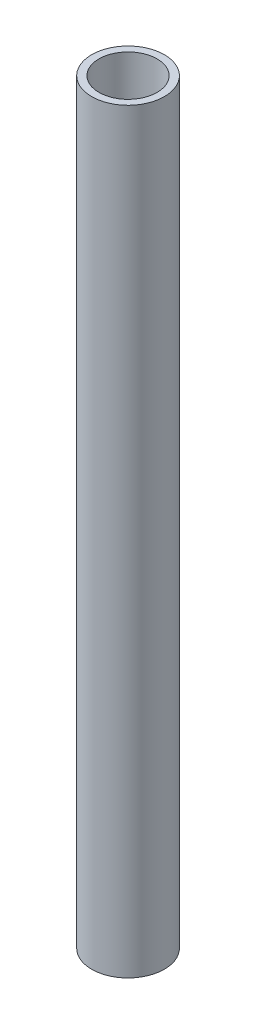
ISO-10303-21;
HEADER;
FILE_DESCRIPTION(('STEP AP214'),'2;1');
FILE_NAME('part.step','',(''),(''),'','','');
FILE_SCHEMA(('AUTOMOTIVE_DESIGN { 1 0 10303 214 1 1 1 1 }'));
ENDSEC;
DATA;
#1=APPLICATION_CONTEXT('core data for automotive mechanical design processes');
#2=APPLICATION_PROTOCOL_DEFINITION('international standard','automotive_design',2000,#1);
#3=PRODUCT_CONTEXT('',#1,'mechanical');
#4=PRODUCT('Part','Part','',(#3));
#5=PRODUCT_RELATED_PRODUCT_CATEGORY('part','',(#4));
#6=PRODUCT_DEFINITION_FORMATION('','',#4);
#7=PRODUCT_DEFINITION_CONTEXT('part definition',#1,'design');
#8=PRODUCT_DEFINITION('design','',#6,#7);
#9=PRODUCT_DEFINITION_SHAPE('','',#8);
#10=(LENGTH_UNIT() NAMED_UNIT(*) SI_UNIT(.MILLI.,.METRE.));
#11=(NAMED_UNIT(*) PLANE_ANGLE_UNIT() SI_UNIT($,.RADIAN.));
#12=(NAMED_UNIT(*) SI_UNIT($,.STERADIAN.) SOLID_ANGLE_UNIT());
#13=UNCERTAINTY_MEASURE_WITH_UNIT(LENGTH_MEASURE(1.E-05),#10,'distance_accuracy_value','');
#14=(GEOMETRIC_REPRESENTATION_CONTEXT(3) GLOBAL_UNCERTAINTY_ASSIGNED_CONTEXT((#13)) GLOBAL_UNIT_ASSIGNED_CONTEXT((#10,
#11,#12)) REPRESENTATION_CONTEXT('',''));
#15=CARTESIAN_POINT('',(0.,0.,0.));
#16=DIRECTION('',(0.,0.,1.));
#17=DIRECTION('',(1.,0.,0.));
#18=AXIS2_PLACEMENT_3D('',#15,#16,#17);
#19=CARTESIAN_POINT('',(0.,26.,0.));
#20=DIRECTION('',(0.,1.,0.));
#21=DIRECTION('',(0.,0.,1.));
#22=AXIS2_PLACEMENT_3D('',#19,#20,#21);
#23=PLANE('',#22);
#24=CARTESIAN_POINT('',(0.,26.,0.));
#25=DIRECTION('',(0.,1.,0.));
#26=DIRECTION('',(0.,0.,1.));
#27=AXIS2_PLACEMENT_3D('',#24,#25,#26);
#28=CIRCLE('',#27,1.25);
#29=CARTESIAN_POINT('',(0.,26.,-1.25));
#30=VERTEX_POINT('',#29);
#31=EDGE_CURVE('E10',#30,#30,#28,.T.);
#32=ORIENTED_EDGE('',*,*,#31,.T.);
#33=EDGE_LOOP('',(#32));
#34=FACE_BOUND('',#33,.T.);
#35=CARTESIAN_POINT('',(0.,26.,0.));
#36=DIRECTION('',(0.,1.,0.));
#37=DIRECTION('',(0.,0.,1.));
#38=AXIS2_PLACEMENT_3D('',#35,#36,#37);
#39=CIRCLE('',#38,1.);
#40=CARTESIAN_POINT('',(0.,26.,-1.));
#41=VERTEX_POINT('',#40);
#42=EDGE_CURVE('E41',#41,#41,#39,.T.);
#43=ORIENTED_EDGE('',*,*,#42,.F.);
#44=EDGE_LOOP('',(#43));
#45=FACE_BOUND('',#44,.T.);
#46=ADVANCED_FACE('F30',(#34,#45),#23,.T.);
#47=CARTESIAN_POINT('',(0.,0.,0.));
#48=DIRECTION('',(0.,1.,0.));
#49=DIRECTION('',(0.,0.,1.));
#50=AXIS2_PLACEMENT_3D('',#47,#48,#49);
#51=PLANE('',#50);
#52=CARTESIAN_POINT('',(0.,0.,0.));
#53=DIRECTION('',(0.,1.,0.));
#54=DIRECTION('',(0.,0.,1.));
#55=AXIS2_PLACEMENT_3D('',#52,#53,#54);
#56=CIRCLE('',#55,1.25);
#57=CARTESIAN_POINT('',(0.,0.,-1.25));
#58=VERTEX_POINT('',#57);
#59=EDGE_CURVE('E34',#58,#58,#56,.T.);
#60=ORIENTED_EDGE('',*,*,#59,.F.);
#61=EDGE_LOOP('',(#60));
#62=FACE_BOUND('',#61,.T.);
#63=CARTESIAN_POINT('',(0.,0.,0.));
#64=DIRECTION('',(0.,1.,0.));
#65=DIRECTION('',(0.,0.,1.));
#66=AXIS2_PLACEMENT_3D('',#63,#64,#65);
#67=CIRCLE('',#66,1.);
#68=CARTESIAN_POINT('',(0.,0.,-1.));
#69=VERTEX_POINT('',#68);
#70=EDGE_CURVE('E43',#69,#69,#67,.T.);
#71=ORIENTED_EDGE('',*,*,#70,.T.);
#72=EDGE_LOOP('',(#71));
#73=FACE_BOUND('',#72,.T.);
#74=ADVANCED_FACE('F53',(#62,#73),#51,.F.);
#75=CARTESIAN_POINT('',(0.,26.,0.));
#76=DIRECTION('',(0.,-1.,0.));
#77=DIRECTION('',(0.,0.,-1.));
#78=AXIS2_PLACEMENT_3D('',#75,#76,#77);
#79=CYLINDRICAL_SURFACE('',#78,1.25);
#80=CARTESIAN_POINT('',(0.,26.,-1.25));
#81=CARTESIAN_POINT('',(0.,25.7291666666667,-1.25));
#82=CARTESIAN_POINT('',(0.,25.4583333333333,-1.25));
#83=CARTESIAN_POINT('',(0.,24.9166666666667,-1.25));
#84=CARTESIAN_POINT('',(0.,24.6458333333333,-1.25));
#85=CARTESIAN_POINT('',(0.,24.1041666666667,-1.25));
#86=CARTESIAN_POINT('',(0.,23.8333333333333,-1.25));
#87=CARTESIAN_POINT('',(0.,23.2916666666667,-1.25));
#88=CARTESIAN_POINT('',(0.,23.0208333333333,-1.25));
#89=CARTESIAN_POINT('',(0.,22.4791666666667,-1.25));
#90=CARTESIAN_POINT('',(0.,22.2083333333333,-1.25));
#91=CARTESIAN_POINT('',(0.,21.6666666666667,-1.25));
#92=CARTESIAN_POINT('',(0.,21.3958333333333,-1.25));
#93=CARTESIAN_POINT('',(0.,20.8541666666667,-1.25));
#94=CARTESIAN_POINT('',(0.,20.5833333333333,-1.25));
#95=CARTESIAN_POINT('',(0.,20.0416666666667,-1.25));
#96=CARTESIAN_POINT('',(0.,19.7708333333333,-1.25));
#97=CARTESIAN_POINT('',(0.,19.2291666666667,-1.25));
#98=CARTESIAN_POINT('',(0.,18.9583333333333,-1.25));
#99=CARTESIAN_POINT('',(0.,18.4166666666667,-1.25));
#100=CARTESIAN_POINT('',(0.,18.1458333333333,-1.25));
#101=CARTESIAN_POINT('',(0.,17.6041666666667,-1.25));
#102=CARTESIAN_POINT('',(0.,17.3333333333333,-1.25));
#103=CARTESIAN_POINT('',(0.,16.7916666666667,-1.25));
#104=CARTESIAN_POINT('',(0.,16.5208333333333,-1.25));
#105=CARTESIAN_POINT('',(0.,15.9791666666667,-1.25));
#106=CARTESIAN_POINT('',(0.,15.7083333333333,-1.25));
#107=CARTESIAN_POINT('',(0.,15.1666666666667,-1.25));
#108=CARTESIAN_POINT('',(0.,14.8958333333333,-1.25));
#109=CARTESIAN_POINT('',(0.,14.3541666666667,-1.25));
#110=CARTESIAN_POINT('',(0.,14.0833333333333,-1.25));
#111=CARTESIAN_POINT('',(0.,13.5416666666667,-1.25));
#112=CARTESIAN_POINT('',(0.,13.2708333333333,-1.25));
#113=CARTESIAN_POINT('',(0.,12.7291666666667,-1.25));
#114=CARTESIAN_POINT('',(0.,12.4583333333333,-1.25));
#115=CARTESIAN_POINT('',(0.,11.9166666666667,-1.25));
#116=CARTESIAN_POINT('',(0.,11.6458333333333,-1.25));
#117=CARTESIAN_POINT('',(0.,11.1041666666667,-1.25));
#118=CARTESIAN_POINT('',(0.,10.8333333333333,-1.25));
#119=CARTESIAN_POINT('',(0.,10.2916666666667,-1.25));
#120=CARTESIAN_POINT('',(0.,10.0208333333333,-1.25));
#121=CARTESIAN_POINT('',(0.,9.47916666666667,-1.25));
#122=CARTESIAN_POINT('',(0.,9.20833333333333,-1.25));
#123=CARTESIAN_POINT('',(0.,8.66666666666667,-1.25));
#124=CARTESIAN_POINT('',(0.,8.39583333333333,-1.25));
#125=CARTESIAN_POINT('',(0.,7.85416666666667,-1.25));
#126=CARTESIAN_POINT('',(0.,7.58333333333333,-1.25));
#127=CARTESIAN_POINT('',(0.,7.04166666666667,-1.25));
#128=CARTESIAN_POINT('',(0.,6.77083333333333,-1.25));
#129=CARTESIAN_POINT('',(0.,6.22916666666667,-1.25));
#130=CARTESIAN_POINT('',(0.,5.95833333333333,-1.25));
#131=CARTESIAN_POINT('',(0.,5.41666666666667,-1.25));
#132=CARTESIAN_POINT('',(0.,5.14583333333333,-1.25));
#133=CARTESIAN_POINT('',(0.,4.60416666666667,-1.25));
#134=CARTESIAN_POINT('',(0.,4.33333333333333,-1.25));
#135=CARTESIAN_POINT('',(0.,3.79166666666667,-1.25));
#136=CARTESIAN_POINT('',(0.,3.52083333333333,-1.25));
#137=CARTESIAN_POINT('',(0.,2.97916666666667,-1.25));
#138=CARTESIAN_POINT('',(0.,2.70833333333333,-1.25));
#139=CARTESIAN_POINT('',(0.,2.16666666666667,-1.25));
#140=CARTESIAN_POINT('',(0.,1.89583333333333,-1.25));
#141=CARTESIAN_POINT('',(0.,1.35416666666667,-1.25));
#142=CARTESIAN_POINT('',(0.,1.08333333333333,-1.25));
#143=CARTESIAN_POINT('',(0.,0.541666666666667,-1.25));
#144=CARTESIAN_POINT('',(0.,0.270833333333334,-1.25));
#145=CARTESIAN_POINT('',(0.,0.,-1.25));
#146=B_SPLINE_CURVE_WITH_KNOTS('',3,(#80,#81,#82,#83,#84,#85,#86,#87,#88,#89,#90,#91,#92,#93,
#94,#95,#96,#97,#98,#99,#100,#101,#102,#103,#104,#105,#106,#107,#108,#109,#110,#111,#112,#113,
#114,#115,#116,#117,#118,#119,#120,#121,#122,#123,#124,#125,#126,#127,#128,#129,#130,#131,#132,
#133,#134,#135,#136,#137,#138,#139,#140,#141,#142,#143,#144,#145),.UNSPECIFIED.,.F.,.F.,(4,2,2,
2,2,2,2,2,2,2,2,2,2,2,2,2,2,2,2,2,2,2,2,2,2,2,2,2,2,2,2,2,4),(0.,0.812499999999997,1.625,2.4375,
3.25,4.0625,4.875,5.6875,6.5,7.3125,8.125,8.93749999999999,9.74999999999999,10.5625,11.375,
12.1875,13.,13.8125,14.625,15.4375,16.25,17.0625,17.875,18.6875,19.5,20.3125,21.125,21.9375,
22.75,23.5625,24.375,25.1875,26.),.UNSPECIFIED.);
#147=EDGE_CURVE('BSEAM32',#30,#58,#146,.T.);
#148=ORIENTED_EDGE('',*,*,#31,.F.);
#149=ORIENTED_EDGE('',*,*,#59,.T.);
#150=ORIENTED_EDGE('',*,*,#147,.T.);
#151=ORIENTED_EDGE('',*,*,#147,.F.);
#152=EDGE_LOOP('',(#148,#150,#149,#151));
#153=FACE_BOUND('',#152,.T.);
#154=ADVANCED_FACE('F32',(#153),#79,.T.);
#155=CARTESIAN_POINT('',(0.,26.,0.));
#156=DIRECTION('',(0.,-1.,0.));
#157=DIRECTION('',(0.,0.,-1.));
#158=AXIS2_PLACEMENT_3D('',#155,#156,#157);
#159=CYLINDRICAL_SURFACE('',#158,1.);
#160=CARTESIAN_POINT('',(0.,26.,-1.));
#161=CARTESIAN_POINT('',(0.,25.7291666666667,-1.));
#162=CARTESIAN_POINT('',(0.,25.4583333333333,-1.));
#163=CARTESIAN_POINT('',(0.,24.9166666666667,-1.));
#164=CARTESIAN_POINT('',(0.,24.6458333333333,-1.));
#165=CARTESIAN_POINT('',(0.,24.1041666666667,-1.));
#166=CARTESIAN_POINT('',(0.,23.8333333333333,-1.));
#167=CARTESIAN_POINT('',(0.,23.2916666666667,-1.));
#168=CARTESIAN_POINT('',(0.,23.0208333333333,-1.));
#169=CARTESIAN_POINT('',(0.,22.4791666666667,-1.));
#170=CARTESIAN_POINT('',(0.,22.2083333333333,-1.));
#171=CARTESIAN_POINT('',(0.,21.6666666666667,-1.));
#172=CARTESIAN_POINT('',(0.,21.3958333333333,-1.));
#173=CARTESIAN_POINT('',(0.,20.8541666666667,-1.));
#174=CARTESIAN_POINT('',(0.,20.5833333333333,-1.));
#175=CARTESIAN_POINT('',(0.,20.0416666666667,-1.));
#176=CARTESIAN_POINT('',(0.,19.7708333333333,-1.));
#177=CARTESIAN_POINT('',(0.,19.2291666666667,-1.));
#178=CARTESIAN_POINT('',(0.,18.9583333333333,-1.));
#179=CARTESIAN_POINT('',(0.,18.4166666666667,-1.));
#180=CARTESIAN_POINT('',(0.,18.1458333333333,-1.));
#181=CARTESIAN_POINT('',(0.,17.6041666666667,-1.));
#182=CARTESIAN_POINT('',(0.,17.3333333333333,-1.));
#183=CARTESIAN_POINT('',(0.,16.7916666666667,-1.));
#184=CARTESIAN_POINT('',(0.,16.5208333333333,-1.));
#185=CARTESIAN_POINT('',(0.,15.9791666666667,-1.));
#186=CARTESIAN_POINT('',(0.,15.7083333333333,-1.));
#187=CARTESIAN_POINT('',(0.,15.1666666666667,-1.));
#188=CARTESIAN_POINT('',(0.,14.8958333333333,-1.));
#189=CARTESIAN_POINT('',(0.,14.3541666666667,-1.));
#190=CARTESIAN_POINT('',(0.,14.0833333333333,-1.));
#191=CARTESIAN_POINT('',(0.,13.5416666666667,-1.));
#192=CARTESIAN_POINT('',(0.,13.2708333333333,-1.));
#193=CARTESIAN_POINT('',(0.,12.7291666666667,-1.));
#194=CARTESIAN_POINT('',(0.,12.4583333333333,-1.));
#195=CARTESIAN_POINT('',(0.,11.9166666666667,-1.));
#196=CARTESIAN_POINT('',(0.,11.6458333333333,-1.));
#197=CARTESIAN_POINT('',(0.,11.1041666666667,-1.));
#198=CARTESIAN_POINT('',(0.,10.8333333333333,-1.));
#199=CARTESIAN_POINT('',(0.,10.2916666666667,-1.));
#200=CARTESIAN_POINT('',(0.,10.0208333333333,-1.));
#201=CARTESIAN_POINT('',(0.,9.47916666666667,-1.));
#202=CARTESIAN_POINT('',(0.,9.20833333333333,-1.));
#203=CARTESIAN_POINT('',(0.,8.66666666666667,-1.));
#204=CARTESIAN_POINT('',(0.,8.39583333333333,-1.));
#205=CARTESIAN_POINT('',(0.,7.85416666666667,-1.));
#206=CARTESIAN_POINT('',(0.,7.58333333333333,-1.));
#207=CARTESIAN_POINT('',(0.,7.04166666666667,-1.));
#208=CARTESIAN_POINT('',(0.,6.77083333333333,-1.));
#209=CARTESIAN_POINT('',(0.,6.22916666666667,-1.));
#210=CARTESIAN_POINT('',(0.,5.95833333333333,-1.));
#211=CARTESIAN_POINT('',(0.,5.41666666666667,-1.));
#212=CARTESIAN_POINT('',(0.,5.14583333333333,-1.));
#213=CARTESIAN_POINT('',(0.,4.60416666666667,-1.));
#214=CARTESIAN_POINT('',(0.,4.33333333333333,-1.));
#215=CARTESIAN_POINT('',(0.,3.79166666666667,-1.));
#216=CARTESIAN_POINT('',(0.,3.52083333333333,-1.));
#217=CARTESIAN_POINT('',(0.,2.97916666666667,-1.));
#218=CARTESIAN_POINT('',(0.,2.70833333333333,-1.));
#219=CARTESIAN_POINT('',(0.,2.16666666666667,-1.));
#220=CARTESIAN_POINT('',(0.,1.89583333333333,-1.));
#221=CARTESIAN_POINT('',(0.,1.35416666666667,-1.));
#222=CARTESIAN_POINT('',(0.,1.08333333333333,-1.));
#223=CARTESIAN_POINT('',(0.,0.541666666666667,-1.));
#224=CARTESIAN_POINT('',(0.,0.270833333333334,-1.));
#225=CARTESIAN_POINT('',(0.,0.,-1.));
#226=B_SPLINE_CURVE_WITH_KNOTS('',3,(#160,#161,#162,#163,#164,#165,#166,#167,#168,#169,#170,
#171,#172,#173,#174,#175,#176,#177,#178,#179,#180,#181,#182,#183,#184,#185,#186,#187,#188,#189,
#190,#191,#192,#193,#194,#195,#196,#197,#198,#199,#200,#201,#202,#203,#204,#205,#206,#207,#208,
#209,#210,#211,#212,#213,#214,#215,#216,#217,#218,#219,#220,#221,#222,#223,#224,#225),
.UNSPECIFIED.,.F.,.F.,(4,2,2,2,2,2,2,2,2,2,2,2,2,2,2,2,2,2,2,2,2,2,2,2,2,2,2,2,2,2,2,2,4),(0.,
0.812499999999997,1.625,2.4375,3.25,4.0625,4.875,5.6875,6.5,7.3125,8.125,8.93749999999999,
9.74999999999999,10.5625,11.375,12.1875,13.,13.8125,14.625,15.4375,16.25,17.0625,17.875,18.6875,
19.5,20.3125,21.125,21.9375,22.75,23.5625,24.375,25.1875,26.),.UNSPECIFIED.);
#227=EDGE_CURVE('BSEAM49',#41,#69,#226,.T.);
#228=ORIENTED_EDGE('',*,*,#42,.T.);
#229=ORIENTED_EDGE('',*,*,#70,.F.);
#230=ORIENTED_EDGE('',*,*,#227,.T.);
#231=ORIENTED_EDGE('',*,*,#227,.F.);
#232=EDGE_LOOP('',(#228,#230,#229,#231));
#233=FACE_BOUND('',#232,.T.);
#234=ADVANCED_FACE('F49',(#233),#159,.F.);
#235=CLOSED_SHELL('',(#46,#74,#154,#234));
#236=MANIFOLD_SOLID_BREP('B2',#235);
#237=ADVANCED_BREP_SHAPE_REPRESENTATION('',(#18,#236),#14);
#238=SHAPE_DEFINITION_REPRESENTATION(#9,#237);
ENDSEC;
END-ISO-10303-21;
